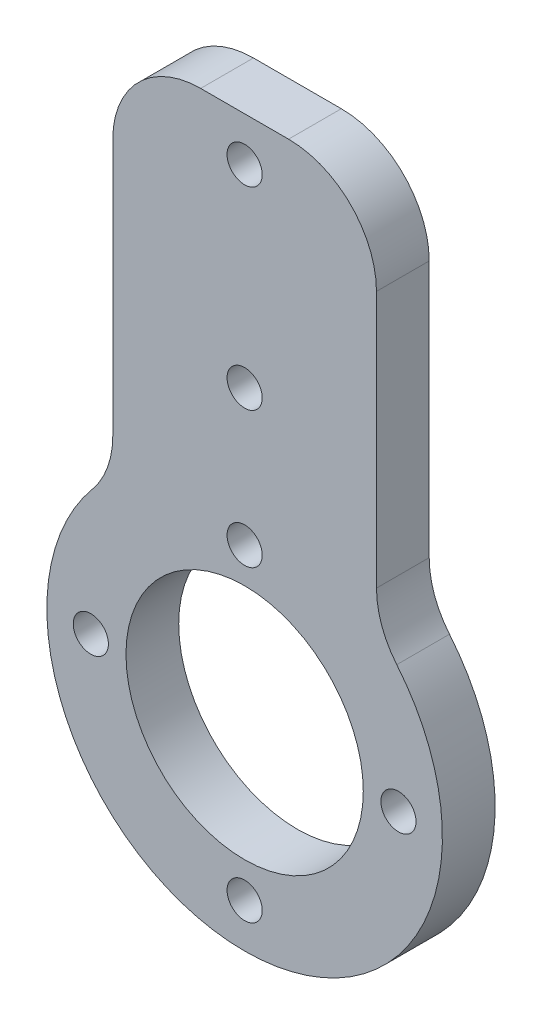
ISO-10303-21;
HEADER;
FILE_DESCRIPTION(('STEP AP214'),'2;1');
FILE_NAME('part.step','',(''),(''),'','','');
FILE_SCHEMA(('AUTOMOTIVE_DESIGN { 1 0 10303 214 1 1 1 1 }'));
ENDSEC;
DATA;
#1=APPLICATION_CONTEXT('core data for automotive mechanical design processes');
#2=APPLICATION_PROTOCOL_DEFINITION('international standard','automotive_design',2000,#1);
#3=PRODUCT_CONTEXT('',#1,'mechanical');
#4=PRODUCT('Part','Part','',(#3));
#5=PRODUCT_RELATED_PRODUCT_CATEGORY('part','',(#4));
#6=PRODUCT_DEFINITION_FORMATION('','',#4);
#7=PRODUCT_DEFINITION_CONTEXT('part definition',#1,'design');
#8=PRODUCT_DEFINITION('design','',#6,#7);
#9=PRODUCT_DEFINITION_SHAPE('','',#8);
#10=(LENGTH_UNIT() NAMED_UNIT(*) SI_UNIT(.MILLI.,.METRE.));
#11=(NAMED_UNIT(*) PLANE_ANGLE_UNIT() SI_UNIT($,.RADIAN.));
#12=(NAMED_UNIT(*) SI_UNIT($,.STERADIAN.) SOLID_ANGLE_UNIT());
#13=UNCERTAINTY_MEASURE_WITH_UNIT(LENGTH_MEASURE(1.E-05),#10,'distance_accuracy_value','');
#14=(GEOMETRIC_REPRESENTATION_CONTEXT(3) GLOBAL_UNCERTAINTY_ASSIGNED_CONTEXT((#13)) GLOBAL_UNIT_ASSIGNED_CONTEXT((#10,
#11,#12)) REPRESENTATION_CONTEXT('',''));
#15=CARTESIAN_POINT('',(0.,0.,0.));
#16=DIRECTION('',(0.,0.,1.));
#17=DIRECTION('',(1.,0.,0.));
#18=AXIS2_PLACEMENT_3D('',#15,#16,#17);
#19=CARTESIAN_POINT('',(-15.,0.,-3.));
#20=DIRECTION('',(1.,0.,0.));
#21=DIRECTION('',(0.,1.,0.));
#22=AXIS2_PLACEMENT_3D('',#19,#20,#21);
#23=PLANE('',#22);
#24=DIRECTION('',(0.,-1.,0.));
#25=VECTOR('',#24,1.);
#26=CARTESIAN_POINT('',(-15.,0.,-3.));
#27=LINE('',#26,#25);
#28=CARTESIAN_POINT('',(-15.,50.,-3.));
#29=VERTEX_POINT('',#28);
#30=CARTESIAN_POINT('',(-15.,20.7665596572952,-3.));
#31=VERTEX_POINT('',#30);
#32=EDGE_CURVE('E201',#29,#31,#27,.T.);
#33=ORIENTED_EDGE('',*,*,#32,.T.);
#34=DIRECTION('',(0.,0.,-1.));
#35=VECTOR('',#34,1.);
#36=CARTESIAN_POINT('',(-15.,20.7665596572952,-3.));
#37=LINE('',#36,#35);
#38=CARTESIAN_POINT('',(-15.,20.7665596572952,3.));
#39=VERTEX_POINT('',#38);
#40=EDGE_CURVE('E173',#39,#31,#37,.T.);
#41=ORIENTED_EDGE('',*,*,#40,.F.);
#42=DIRECTION('',(0.,-1.,0.));
#43=VECTOR('',#42,1.);
#44=CARTESIAN_POINT('',(-15.,0.,3.));
#45=LINE('',#44,#43);
#46=CARTESIAN_POINT('',(-15.,50.,3.));
#47=VERTEX_POINT('',#46);
#48=EDGE_CURVE('E194',#47,#39,#45,.T.);
#49=ORIENTED_EDGE('',*,*,#48,.F.);
#50=DIRECTION('',(0.,0.,1.));
#51=VECTOR('',#50,1.);
#52=CARTESIAN_POINT('',(-15.,50.,3.));
#53=LINE('',#52,#51);
#54=EDGE_CURVE('E121',#29,#47,#53,.T.);
#55=ORIENTED_EDGE('',*,*,#54,.F.);
#56=EDGE_LOOP('',(#33,#41,#49,#55));
#57=FACE_BOUND('',#56,.T.);
#58=ADVANCED_FACE('F49',(#57),#23,.F.);
#59=CARTESIAN_POINT('',(0.,0.,-3.));
#60=DIRECTION('',(0.,0.,1.));
#61=DIRECTION('',(-1.,0.,0.));
#62=AXIS2_PLACEMENT_3D('',#59,#60,#61);
#63=CYLINDRICAL_SURFACE('',#62,22.5);
#64=CARTESIAN_POINT('',(0.,0.,3.));
#65=DIRECTION('',(0.,0.,1.));
#66=DIRECTION('',(1.,0.,0.));
#67=AXIS2_PLACEMENT_3D('',#64,#65,#66);
#68=CIRCLE('',#67,22.5);
#69=CARTESIAN_POINT('',(-17.3076923076923,14.3768489935121,3.));
#70=VERTEX_POINT('',#69);
#71=CARTESIAN_POINT('',(17.3076923076923,14.3768489935121,3.));
#72=VERTEX_POINT('',#71);
#73=EDGE_CURVE('E197',#70,#72,#68,.T.);
#74=ORIENTED_EDGE('',*,*,#73,.F.);
#75=DIRECTION('',(0.,0.,1.));
#76=VECTOR('',#75,1.);
#77=CARTESIAN_POINT('',(-17.3076923076923,14.3768489935121,-3.));
#78=LINE('',#77,#76);
#79=CARTESIAN_POINT('',(-17.3076923076923,14.3768489935121,-3.));
#80=VERTEX_POINT('',#79);
#81=EDGE_CURVE('E178',#80,#70,#78,.T.);
#82=ORIENTED_EDGE('',*,*,#81,.F.);
#83=CARTESIAN_POINT('',(0.,0.,-3.));
#84=DIRECTION('',(0.,0.,1.));
#85=DIRECTION('',(1.,0.,0.));
#86=AXIS2_PLACEMENT_3D('',#83,#84,#85);
#87=CIRCLE('',#86,22.5);
#88=CARTESIAN_POINT('',(17.3076923076923,14.3768489935121,-3.));
#89=VERTEX_POINT('',#88);
#90=EDGE_CURVE('E203',#80,#89,#87,.T.);
#91=ORIENTED_EDGE('',*,*,#90,.T.);
#92=DIRECTION('',(0.,0.,1.));
#93=VECTOR('',#92,1.);
#94=CARTESIAN_POINT('',(17.3076923076923,14.3768489935121,-3.));
#95=LINE('',#94,#93);
#96=EDGE_CURVE('E181',#72,#89,#95,.F.);
#97=ORIENTED_EDGE('',*,*,#96,.F.);
#98=EDGE_LOOP('',(#74,#82,#91,#97));
#99=FACE_BOUND('',#98,.T.);
#100=ADVANCED_FACE('F298',(#99),#63,.T.);
#101=CARTESIAN_POINT('',(15.,0.,-3.));
#102=DIRECTION('',(1.,0.,0.));
#103=DIRECTION('',(0.,1.,0.));
#104=AXIS2_PLACEMENT_3D('',#101,#102,#103);
#105=PLANE('',#104);
#106=DIRECTION('',(0.,-1.,0.));
#107=VECTOR('',#106,1.);
#108=CARTESIAN_POINT('',(15.,0.,3.));
#109=LINE('',#108,#107);
#110=CARTESIAN_POINT('',(15.,50.,3.));
#111=VERTEX_POINT('',#110);
#112=CARTESIAN_POINT('',(15.,20.7665596572952,3.));
#113=VERTEX_POINT('',#112);
#114=EDGE_CURVE('E139',#111,#113,#109,.T.);
#115=ORIENTED_EDGE('',*,*,#114,.T.);
#116=DIRECTION('',(0.,0.,1.));
#117=VECTOR('',#116,1.);
#118=CARTESIAN_POINT('',(15.,20.7665596572952,-3.));
#119=LINE('',#118,#117);
#120=CARTESIAN_POINT('',(15.,20.7665596572952,-3.));
#121=VERTEX_POINT('',#120);
#122=EDGE_CURVE('E159',#121,#113,#119,.T.);
#123=ORIENTED_EDGE('',*,*,#122,.F.);
#124=DIRECTION('',(0.,-1.,0.));
#125=VECTOR('',#124,1.);
#126=CARTESIAN_POINT('',(15.,0.,-3.));
#127=LINE('',#126,#125);
#128=CARTESIAN_POINT('',(15.,50.,-3.));
#129=VERTEX_POINT('',#128);
#130=EDGE_CURVE('E209',#129,#121,#127,.T.);
#131=ORIENTED_EDGE('',*,*,#130,.F.);
#132=DIRECTION('',(0.,0.,1.));
#133=VECTOR('',#132,1.);
#134=CARTESIAN_POINT('',(15.,50.,-3.));
#135=LINE('',#134,#133);
#136=EDGE_CURVE('E163',#111,#129,#135,.F.);
#137=ORIENTED_EDGE('',*,*,#136,.F.);
#138=EDGE_LOOP('',(#115,#123,#131,#137));
#139=FACE_BOUND('',#138,.T.);
#140=ADVANCED_FACE('F302',(#139),#105,.T.);
#141=CARTESIAN_POINT('',(0.,17.5,-3.));
#142=DIRECTION('',(0.,0.,1.));
#143=DIRECTION('',(-1.,0.,0.));
#144=AXIS2_PLACEMENT_3D('',#141,#142,#143);
#145=CYLINDRICAL_SURFACE('',#144,2.);
#146=CARTESIAN_POINT('',(0.,17.5,-3.));
#147=DIRECTION('',(0.,0.,1.));
#148=DIRECTION('',(1.,0.,0.));
#149=AXIS2_PLACEMENT_3D('',#146,#147,#148);
#150=CIRCLE('',#149,2.);
#151=CARTESIAN_POINT('',(2.,17.5,-3.));
#152=VERTEX_POINT('',#151);
#153=EDGE_CURVE('E151',#152,#152,#150,.T.);
#154=ORIENTED_EDGE('',*,*,#153,.F.);
#155=EDGE_LOOP('',(#154));
#156=FACE_BOUND('',#155,.T.);
#157=CARTESIAN_POINT('',(0.,17.5,3.));
#158=DIRECTION('',(0.,0.,1.));
#159=DIRECTION('',(1.,0.,0.));
#160=AXIS2_PLACEMENT_3D('',#157,#158,#159);
#161=CIRCLE('',#160,2.);
#162=CARTESIAN_POINT('',(2.,17.5,3.));
#163=VERTEX_POINT('',#162);
#164=EDGE_CURVE('E257',#163,#163,#161,.T.);
#165=ORIENTED_EDGE('',*,*,#164,.T.);
#166=EDGE_LOOP('',(#165));
#167=FACE_BOUND('',#166,.T.);
#168=ADVANCED_FACE('F307',(#156,#167),#145,.F.);
#169=CARTESIAN_POINT('',(17.5,0.,-3.));
#170=DIRECTION('',(0.,0.,1.));
#171=DIRECTION('',(-1.,0.,0.));
#172=AXIS2_PLACEMENT_3D('',#169,#170,#171);
#173=CYLINDRICAL_SURFACE('',#172,2.);
#174=CARTESIAN_POINT('',(17.5,0.,-3.));
#175=DIRECTION('',(0.,0.,1.));
#176=DIRECTION('',(1.,0.,0.));
#177=AXIS2_PLACEMENT_3D('',#174,#175,#176);
#178=CIRCLE('',#177,2.);
#179=CARTESIAN_POINT('',(19.5,0.,-3.));
#180=VERTEX_POINT('',#179);
#181=EDGE_CURVE('E228',#180,#180,#178,.T.);
#182=ORIENTED_EDGE('',*,*,#181,.F.);
#183=EDGE_LOOP('',(#182));
#184=FACE_BOUND('',#183,.T.);
#185=CARTESIAN_POINT('',(17.5,0.,3.));
#186=DIRECTION('',(0.,0.,1.));
#187=DIRECTION('',(1.,0.,0.));
#188=AXIS2_PLACEMENT_3D('',#185,#186,#187);
#189=CIRCLE('',#188,2.);
#190=CARTESIAN_POINT('',(19.5,0.,3.));
#191=VERTEX_POINT('',#190);
#192=EDGE_CURVE('E254',#191,#191,#189,.T.);
#193=ORIENTED_EDGE('',*,*,#192,.T.);
#194=EDGE_LOOP('',(#193));
#195=FACE_BOUND('',#194,.T.);
#196=ADVANCED_FACE('F316',(#184,#195),#173,.F.);
#197=CARTESIAN_POINT('',(0.,-17.5,-3.));
#198=DIRECTION('',(0.,0.,1.));
#199=DIRECTION('',(-1.,0.,0.));
#200=AXIS2_PLACEMENT_3D('',#197,#198,#199);
#201=CYLINDRICAL_SURFACE('',#200,2.);
#202=CARTESIAN_POINT('',(0.,-17.5,-3.));
#203=DIRECTION('',(0.,0.,1.));
#204=DIRECTION('',(1.,0.,0.));
#205=AXIS2_PLACEMENT_3D('',#202,#203,#204);
#206=CIRCLE('',#205,2.);
#207=CARTESIAN_POINT('',(2.,-17.5,-3.));
#208=VERTEX_POINT('',#207);
#209=EDGE_CURVE('E224',#208,#208,#206,.T.);
#210=ORIENTED_EDGE('',*,*,#209,.F.);
#211=EDGE_LOOP('',(#210));
#212=FACE_BOUND('',#211,.T.);
#213=CARTESIAN_POINT('',(0.,-17.5,3.));
#214=DIRECTION('',(0.,0.,1.));
#215=DIRECTION('',(1.,0.,0.));
#216=AXIS2_PLACEMENT_3D('',#213,#214,#215);
#217=CIRCLE('',#216,2.);
#218=CARTESIAN_POINT('',(2.,-17.5,3.));
#219=VERTEX_POINT('',#218);
#220=EDGE_CURVE('E250',#219,#219,#217,.T.);
#221=ORIENTED_EDGE('',*,*,#220,.T.);
#222=EDGE_LOOP('',(#221));
#223=FACE_BOUND('',#222,.T.);
#224=ADVANCED_FACE('F312',(#212,#223),#201,.F.);
#225=CARTESIAN_POINT('',(-17.5,0.,-3.));
#226=DIRECTION('',(0.,0.,1.));
#227=DIRECTION('',(-1.,0.,0.));
#228=AXIS2_PLACEMENT_3D('',#225,#226,#227);
#229=CYLINDRICAL_SURFACE('',#228,2.);
#230=CARTESIAN_POINT('',(-17.5,0.,-3.));
#231=DIRECTION('',(0.,0.,1.));
#232=DIRECTION('',(1.,0.,0.));
#233=AXIS2_PLACEMENT_3D('',#230,#231,#232);
#234=CIRCLE('',#233,2.);
#235=CARTESIAN_POINT('',(-15.5,0.,-3.));
#236=VERTEX_POINT('',#235);
#237=EDGE_CURVE('E220',#236,#236,#234,.T.);
#238=ORIENTED_EDGE('',*,*,#237,.F.);
#239=EDGE_LOOP('',(#238));
#240=FACE_BOUND('',#239,.T.);
#241=CARTESIAN_POINT('',(-17.5,0.,3.));
#242=DIRECTION('',(0.,0.,1.));
#243=DIRECTION('',(1.,0.,0.));
#244=AXIS2_PLACEMENT_3D('',#241,#242,#243);
#245=CIRCLE('',#244,2.);
#246=CARTESIAN_POINT('',(-15.5,0.,3.));
#247=VERTEX_POINT('',#246);
#248=EDGE_CURVE('E138',#247,#247,#245,.T.);
#249=ORIENTED_EDGE('',*,*,#248,.T.);
#250=EDGE_LOOP('',(#249));
#251=FACE_BOUND('',#250,.T.);
#252=ADVANCED_FACE('F293',(#240,#251),#229,.F.);
#253=CARTESIAN_POINT('',(0.,60.,-3.));
#254=DIRECTION('',(0.,1.,0.));
#255=DIRECTION('',(0.,0.,-1.));
#256=AXIS2_PLACEMENT_3D('',#253,#254,#255);
#257=PLANE('',#256);
#258=DIRECTION('',(1.,0.,0.));
#259=VECTOR('',#258,1.);
#260=CARTESIAN_POINT('',(0.,60.,-3.));
#261=LINE('',#260,#259);
#262=CARTESIAN_POINT('',(-5.,60.,-3.));
#263=VERTEX_POINT('',#262);
#264=CARTESIAN_POINT('',(5.,60.,-3.));
#265=VERTEX_POINT('',#264);
#266=EDGE_CURVE('E143',#263,#265,#261,.T.);
#267=ORIENTED_EDGE('',*,*,#266,.F.);
#268=DIRECTION('',(0.,0.,1.));
#269=VECTOR('',#268,1.);
#270=CARTESIAN_POINT('',(-5.,60.,-3.));
#271=LINE('',#270,#269);
#272=CARTESIAN_POINT('',(-5.,60.,3.));
#273=VERTEX_POINT('',#272);
#274=EDGE_CURVE('E118',#273,#263,#271,.F.);
#275=ORIENTED_EDGE('',*,*,#274,.F.);
#276=DIRECTION('',(1.,0.,0.));
#277=VECTOR('',#276,1.);
#278=CARTESIAN_POINT('',(0.,60.,3.));
#279=LINE('',#278,#277);
#280=CARTESIAN_POINT('',(5.,60.,3.));
#281=VERTEX_POINT('',#280);
#282=EDGE_CURVE('E130',#273,#281,#279,.T.);
#283=ORIENTED_EDGE('',*,*,#282,.T.);
#284=DIRECTION('',(0.,0.,1.));
#285=VECTOR('',#284,1.);
#286=CARTESIAN_POINT('',(5.,60.,-3.));
#287=LINE('',#286,#285);
#288=EDGE_CURVE('E127',#265,#281,#287,.T.);
#289=ORIENTED_EDGE('',*,*,#288,.F.);
#290=EDGE_LOOP('',(#267,#275,#283,#289));
#291=FACE_BOUND('',#290,.T.);
#292=ADVANCED_FACE('F141',(#291),#257,.T.);
#293=CARTESIAN_POINT('',(0.,55.,-3.));
#294=DIRECTION('',(0.,0.,1.));
#295=DIRECTION('',(-1.,0.,0.));
#296=AXIS2_PLACEMENT_3D('',#293,#294,#295);
#297=CYLINDRICAL_SURFACE('',#296,2.);
#298=CARTESIAN_POINT('',(0.,55.,-3.));
#299=DIRECTION('',(0.,0.,1.));
#300=DIRECTION('',(1.,0.,0.));
#301=AXIS2_PLACEMENT_3D('',#298,#299,#300);
#302=CIRCLE('',#301,2.);
#303=CARTESIAN_POINT('',(2.,55.,-3.));
#304=VERTEX_POINT('',#303);
#305=EDGE_CURVE('E204',#304,#304,#302,.T.);
#306=ORIENTED_EDGE('',*,*,#305,.F.);
#307=EDGE_LOOP('',(#306));
#308=FACE_BOUND('',#307,.T.);
#309=CARTESIAN_POINT('',(0.,55.,3.));
#310=DIRECTION('',(0.,0.,1.));
#311=DIRECTION('',(1.,0.,0.));
#312=AXIS2_PLACEMENT_3D('',#309,#310,#311);
#313=CIRCLE('',#312,2.);
#314=CARTESIAN_POINT('',(2.,55.,3.));
#315=VERTEX_POINT('',#314);
#316=EDGE_CURVE('E198',#315,#315,#313,.T.);
#317=ORIENTED_EDGE('',*,*,#316,.T.);
#318=EDGE_LOOP('',(#317));
#319=FACE_BOUND('',#318,.T.);
#320=ADVANCED_FACE('F277',(#308,#319),#297,.F.);
#321=CARTESIAN_POINT('',(0.,33.,-3.));
#322=DIRECTION('',(0.,0.,1.));
#323=DIRECTION('',(-1.,0.,0.));
#324=AXIS2_PLACEMENT_3D('',#321,#322,#323);
#325=CYLINDRICAL_SURFACE('',#324,2.);
#326=CARTESIAN_POINT('',(0.,33.,-3.));
#327=DIRECTION('',(0.,0.,1.));
#328=DIRECTION('',(1.,0.,0.));
#329=AXIS2_PLACEMENT_3D('',#326,#327,#328);
#330=CIRCLE('',#329,2.);
#331=CARTESIAN_POINT('',(2.,33.,-3.));
#332=VERTEX_POINT('',#331);
#333=EDGE_CURVE('E212',#332,#332,#330,.T.);
#334=ORIENTED_EDGE('',*,*,#333,.F.);
#335=EDGE_LOOP('',(#334));
#336=FACE_BOUND('',#335,.T.);
#337=CARTESIAN_POINT('',(0.,33.,3.));
#338=DIRECTION('',(0.,0.,1.));
#339=DIRECTION('',(1.,0.,0.));
#340=AXIS2_PLACEMENT_3D('',#337,#338,#339);
#341=CIRCLE('',#340,2.);
#342=CARTESIAN_POINT('',(2.,33.,3.));
#343=VERTEX_POINT('',#342);
#344=EDGE_CURVE('E235',#343,#343,#341,.T.);
#345=ORIENTED_EDGE('',*,*,#344,.T.);
#346=EDGE_LOOP('',(#345));
#347=FACE_BOUND('',#346,.T.);
#348=ADVANCED_FACE('F273',(#336,#347),#325,.F.);
#349=CARTESIAN_POINT('',(0.,0.,-3.));
#350=DIRECTION('',(0.,0.,1.));
#351=DIRECTION('',(-1.,0.,0.));
#352=AXIS2_PLACEMENT_3D('',#349,#350,#351);
#353=CYLINDRICAL_SURFACE('',#352,13.5);
#354=CARTESIAN_POINT('',(0.,0.,-3.));
#355=DIRECTION('',(0.,0.,1.));
#356=DIRECTION('',(1.,0.,0.));
#357=AXIS2_PLACEMENT_3D('',#354,#355,#356);
#358=CIRCLE('',#357,13.5);
#359=CARTESIAN_POINT('',(13.5,0.,-3.));
#360=VERTEX_POINT('',#359);
#361=EDGE_CURVE('E145',#360,#360,#358,.T.);
#362=ORIENTED_EDGE('',*,*,#361,.F.);
#363=EDGE_LOOP('',(#362));
#364=FACE_BOUND('',#363,.T.);
#365=CARTESIAN_POINT('',(0.,0.,3.));
#366=DIRECTION('',(0.,0.,1.));
#367=DIRECTION('',(1.,0.,0.));
#368=AXIS2_PLACEMENT_3D('',#365,#366,#367);
#369=CIRCLE('',#368,13.5);
#370=CARTESIAN_POINT('',(13.5,0.,3.));
#371=VERTEX_POINT('',#370);
#372=EDGE_CURVE('E154',#371,#371,#369,.T.);
#373=ORIENTED_EDGE('',*,*,#372,.T.);
#374=EDGE_LOOP('',(#373));
#375=FACE_BOUND('',#374,.T.);
#376=ADVANCED_FACE('F276',(#364,#375),#353,.F.);
#377=CARTESIAN_POINT('',(0.,0.,-3.));
#378=DIRECTION('',(0.,0.,-1.));
#379=DIRECTION('',(1.,0.,0.));
#380=AXIS2_PLACEMENT_3D('',#377,#378,#379);
#381=PLANE('',#380);
#382=ORIENTED_EDGE('',*,*,#333,.T.);
#383=EDGE_LOOP('',(#382));
#384=FACE_BOUND('',#383,.T.);
#385=ORIENTED_EDGE('',*,*,#305,.T.);
#386=EDGE_LOOP('',(#385));
#387=FACE_BOUND('',#386,.T.);
#388=ORIENTED_EDGE('',*,*,#130,.T.);
#389=CARTESIAN_POINT('',(25.,20.7665596572952,-3.));
#390=DIRECTION('',(0.,0.,1.));
#391=DIRECTION('',(1.,0.,0.));
#392=AXIS2_PLACEMENT_3D('',#389,#390,#391);
#393=CIRCLE('',#392,10.);
#394=EDGE_CURVE('E65',#89,#121,#393,.F.);
#395=ORIENTED_EDGE('',*,*,#394,.F.);
#396=ORIENTED_EDGE('',*,*,#90,.F.);
#397=CARTESIAN_POINT('',(-25.,20.7665596572952,-3.));
#398=DIRECTION('',(0.,0.,1.));
#399=DIRECTION('',(1.,0.,0.));
#400=AXIS2_PLACEMENT_3D('',#397,#398,#399);
#401=CIRCLE('',#400,10.);
#402=EDGE_CURVE('E11',#31,#80,#401,.F.);
#403=ORIENTED_EDGE('',*,*,#402,.F.);
#404=ORIENTED_EDGE('',*,*,#32,.F.);
#405=CARTESIAN_POINT('',(-5.,50.,-3.));
#406=DIRECTION('',(0.,0.,1.));
#407=DIRECTION('',(1.,0.,0.));
#408=AXIS2_PLACEMENT_3D('',#405,#406,#407);
#409=CIRCLE('',#408,10.);
#410=EDGE_CURVE('E167',#263,#29,#409,.T.);
#411=ORIENTED_EDGE('',*,*,#410,.F.);
#412=ORIENTED_EDGE('',*,*,#266,.T.);
#413=CARTESIAN_POINT('',(5.,50.,-3.));
#414=DIRECTION('',(0.,0.,1.));
#415=DIRECTION('',(1.,0.,0.));
#416=AXIS2_PLACEMENT_3D('',#413,#414,#415);
#417=CIRCLE('',#416,10.);
#418=EDGE_CURVE('E170',#129,#265,#417,.T.);
#419=ORIENTED_EDGE('',*,*,#418,.F.);
#420=EDGE_LOOP('',(#388,#395,#396,#403,#404,#411,#412,#419));
#421=FACE_BOUND('',#420,.T.);
#422=ORIENTED_EDGE('',*,*,#237,.T.);
#423=EDGE_LOOP('',(#422));
#424=FACE_BOUND('',#423,.T.);
#425=ORIENTED_EDGE('',*,*,#209,.T.);
#426=EDGE_LOOP('',(#425));
#427=FACE_BOUND('',#426,.T.);
#428=ORIENTED_EDGE('',*,*,#181,.T.);
#429=EDGE_LOOP('',(#428));
#430=FACE_BOUND('',#429,.T.);
#431=ORIENTED_EDGE('',*,*,#153,.T.);
#432=EDGE_LOOP('',(#431));
#433=FACE_BOUND('',#432,.T.);
#434=ORIENTED_EDGE('',*,*,#361,.T.);
#435=EDGE_LOOP('',(#434));
#436=FACE_BOUND('',#435,.T.);
#437=ADVANCED_FACE('F270',(#384,#387,#421,#424,#427,#430,#433,#436),#381,.T.);
#438=CARTESIAN_POINT('',(0.,0.,3.));
#439=DIRECTION('',(0.,0.,-1.));
#440=DIRECTION('',(1.,0.,0.));
#441=AXIS2_PLACEMENT_3D('',#438,#439,#440);
#442=PLANE('',#441);
#443=ORIENTED_EDGE('',*,*,#344,.F.);
#444=EDGE_LOOP('',(#443));
#445=FACE_BOUND('',#444,.T.);
#446=ORIENTED_EDGE('',*,*,#316,.F.);
#447=EDGE_LOOP('',(#446));
#448=FACE_BOUND('',#447,.T.);
#449=ORIENTED_EDGE('',*,*,#282,.F.);
#450=CARTESIAN_POINT('',(-5.,50.,3.));
#451=DIRECTION('',(0.,0.,1.));
#452=DIRECTION('',(1.,0.,0.));
#453=AXIS2_PLACEMENT_3D('',#450,#451,#452);
#454=CIRCLE('',#453,10.);
#455=EDGE_CURVE('E114',#47,#273,#454,.F.);
#456=ORIENTED_EDGE('',*,*,#455,.F.);
#457=ORIENTED_EDGE('',*,*,#48,.T.);
#458=CARTESIAN_POINT('',(-25.,20.7665596572952,3.));
#459=DIRECTION('',(0.,0.,1.));
#460=DIRECTION('',(1.,0.,0.));
#461=AXIS2_PLACEMENT_3D('',#458,#459,#460);
#462=CIRCLE('',#461,10.);
#463=EDGE_CURVE('E58',#70,#39,#462,.T.);
#464=ORIENTED_EDGE('',*,*,#463,.F.);
#465=ORIENTED_EDGE('',*,*,#73,.T.);
#466=CARTESIAN_POINT('',(25.,20.7665596572952,3.));
#467=DIRECTION('',(0.,0.,1.));
#468=DIRECTION('',(1.,0.,0.));
#469=AXIS2_PLACEMENT_3D('',#466,#467,#468);
#470=CIRCLE('',#469,10.);
#471=EDGE_CURVE('E184',#113,#72,#470,.T.);
#472=ORIENTED_EDGE('',*,*,#471,.F.);
#473=ORIENTED_EDGE('',*,*,#114,.F.);
#474=CARTESIAN_POINT('',(5.,50.,3.));
#475=DIRECTION('',(0.,0.,1.));
#476=DIRECTION('',(1.,0.,0.));
#477=AXIS2_PLACEMENT_3D('',#474,#475,#476);
#478=CIRCLE('',#477,10.);
#479=EDGE_CURVE('E126',#281,#111,#478,.F.);
#480=ORIENTED_EDGE('',*,*,#479,.F.);
#481=EDGE_LOOP('',(#449,#456,#457,#464,#465,#472,#473,#480));
#482=FACE_BOUND('',#481,.T.);
#483=ORIENTED_EDGE('',*,*,#248,.F.);
#484=EDGE_LOOP('',(#483));
#485=FACE_BOUND('',#484,.T.);
#486=ORIENTED_EDGE('',*,*,#220,.F.);
#487=EDGE_LOOP('',(#486));
#488=FACE_BOUND('',#487,.T.);
#489=ORIENTED_EDGE('',*,*,#192,.F.);
#490=EDGE_LOOP('',(#489));
#491=FACE_BOUND('',#490,.T.);
#492=ORIENTED_EDGE('',*,*,#164,.F.);
#493=EDGE_LOOP('',(#492));
#494=FACE_BOUND('',#493,.T.);
#495=ORIENTED_EDGE('',*,*,#372,.F.);
#496=EDGE_LOOP('',(#495));
#497=FACE_BOUND('',#496,.T.);
#498=ADVANCED_FACE('F131',(#445,#448,#482,#485,#488,#491,#494,#497),#442,.F.);
#499=CARTESIAN_POINT('',(5.,50.,-3.));
#500=DIRECTION('',(0.,0.,1.));
#501=DIRECTION('',(-1.,0.,0.));
#502=AXIS2_PLACEMENT_3D('',#499,#500,#501);
#503=CYLINDRICAL_SURFACE('',#502,10.);
#504=ORIENTED_EDGE('',*,*,#418,.T.);
#505=ORIENTED_EDGE('',*,*,#288,.T.);
#506=ORIENTED_EDGE('',*,*,#479,.T.);
#507=ORIENTED_EDGE('',*,*,#136,.T.);
#508=EDGE_LOOP('',(#504,#505,#506,#507));
#509=FACE_BOUND('',#508,.T.);
#510=ADVANCED_FACE('F283',(#509),#503,.T.);
#511=CARTESIAN_POINT('',(-5.,50.,-3.));
#512=DIRECTION('',(0.,0.,-1.));
#513=DIRECTION('',(1.,0.,0.));
#514=AXIS2_PLACEMENT_3D('',#511,#512,#513);
#515=CYLINDRICAL_SURFACE('',#514,10.);
#516=ORIENTED_EDGE('',*,*,#410,.T.);
#517=ORIENTED_EDGE('',*,*,#54,.T.);
#518=ORIENTED_EDGE('',*,*,#455,.T.);
#519=ORIENTED_EDGE('',*,*,#274,.T.);
#520=EDGE_LOOP('',(#516,#517,#518,#519));
#521=FACE_BOUND('',#520,.T.);
#522=ADVANCED_FACE('F116',(#521),#515,.T.);
#523=CARTESIAN_POINT('',(25.,20.7665596572952,-3.));
#524=DIRECTION('',(0.,0.,1.));
#525=DIRECTION('',(-1.,0.,0.));
#526=AXIS2_PLACEMENT_3D('',#523,#524,#525);
#527=CYLINDRICAL_SURFACE('',#526,10.);
#528=ORIENTED_EDGE('',*,*,#394,.T.);
#529=ORIENTED_EDGE('',*,*,#122,.T.);
#530=ORIENTED_EDGE('',*,*,#471,.T.);
#531=ORIENTED_EDGE('',*,*,#96,.T.);
#532=EDGE_LOOP('',(#528,#529,#530,#531));
#533=FACE_BOUND('',#532,.T.);
#534=ADVANCED_FACE('F350',(#533),#527,.F.);
#535=CARTESIAN_POINT('',(-25.,20.7665596572952,-3.));
#536=DIRECTION('',(0.,0.,1.));
#537=DIRECTION('',(-1.,0.,0.));
#538=AXIS2_PLACEMENT_3D('',#535,#536,#537);
#539=CYLINDRICAL_SURFACE('',#538,10.);
#540=ORIENTED_EDGE('',*,*,#402,.T.);
#541=ORIENTED_EDGE('',*,*,#81,.T.);
#542=ORIENTED_EDGE('',*,*,#463,.T.);
#543=ORIENTED_EDGE('',*,*,#40,.T.);
#544=EDGE_LOOP('',(#540,#541,#542,#543));
#545=FACE_BOUND('',#544,.T.);
#546=ADVANCED_FACE('F51',(#545),#539,.F.);
#547=CLOSED_SHELL('',(#58,#100,#140,#168,#196,#224,#252,#292,#320,#348,#376,#437,#498,#510,#522,
#534,#546));
#548=MANIFOLD_SOLID_BREP('B2',#547);
#549=ADVANCED_BREP_SHAPE_REPRESENTATION('',(#18,#548),#14);
#550=SHAPE_DEFINITION_REPRESENTATION(#9,#549);
ENDSEC;
END-ISO-10303-21;
